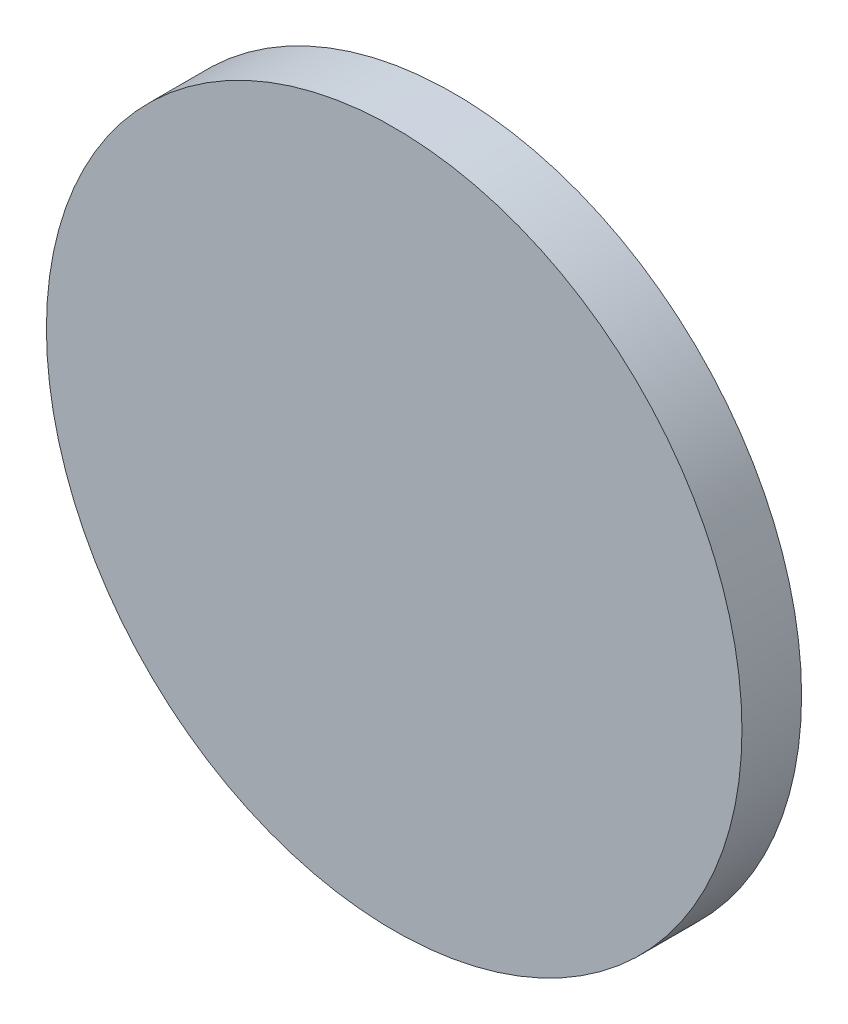
ISO-10303-21;
HEADER;
FILE_DESCRIPTION(('STEP AP214'),'2;1');
FILE_NAME('part.step','',(''),(''),'','','');
FILE_SCHEMA(('AUTOMOTIVE_DESIGN { 1 0 10303 214 1 1 1 1 }'));
ENDSEC;
DATA;
#1=APPLICATION_CONTEXT('core data for automotive mechanical design processes');
#2=APPLICATION_PROTOCOL_DEFINITION('international standard','automotive_design',2000,#1);
#3=PRODUCT_CONTEXT('',#1,'mechanical');
#4=PRODUCT('Part','Part','',(#3));
#5=PRODUCT_RELATED_PRODUCT_CATEGORY('part','',(#4));
#6=PRODUCT_DEFINITION_FORMATION('','',#4);
#7=PRODUCT_DEFINITION_CONTEXT('part definition',#1,'design');
#8=PRODUCT_DEFINITION('design','',#6,#7);
#9=PRODUCT_DEFINITION_SHAPE('','',#8);
#10=(LENGTH_UNIT() NAMED_UNIT(*) SI_UNIT(.MILLI.,.METRE.));
#11=(NAMED_UNIT(*) PLANE_ANGLE_UNIT() SI_UNIT($,.RADIAN.));
#12=(NAMED_UNIT(*) SI_UNIT($,.STERADIAN.) SOLID_ANGLE_UNIT());
#13=UNCERTAINTY_MEASURE_WITH_UNIT(LENGTH_MEASURE(1.E-05),#10,'distance_accuracy_value','');
#14=(GEOMETRIC_REPRESENTATION_CONTEXT(3) GLOBAL_UNCERTAINTY_ASSIGNED_CONTEXT((#13)) GLOBAL_UNIT_ASSIGNED_CONTEXT((#10,
#11,#12)) REPRESENTATION_CONTEXT('',''));
#15=CARTESIAN_POINT('',(0.,0.,0.));
#16=DIRECTION('',(0.,0.,1.));
#17=DIRECTION('',(1.,0.,0.));
#18=AXIS2_PLACEMENT_3D('',#15,#16,#17);
#19=CARTESIAN_POINT('',(0.,0.,0.));
#20=DIRECTION('',(0.,0.,-1.));
#21=DIRECTION('',(-1.,0.,0.));
#22=AXIS2_PLACEMENT_3D('',#19,#20,#21);
#23=PLANE('',#22);
#24=CARTESIAN_POINT('',(0.,0.,0.));
#25=DIRECTION('',(0.,0.,1.));
#26=DIRECTION('',(1.,0.,0.));
#27=AXIS2_PLACEMENT_3D('',#24,#25,#26);
#28=CIRCLE('',#27,66.675);
#29=CARTESIAN_POINT('',(66.675,0.,0.));
#30=VERTEX_POINT('',#29);
#31=EDGE_CURVE('E10',#30,#30,#28,.T.);
#32=ORIENTED_EDGE('',*,*,#31,.T.);
#33=EDGE_LOOP('',(#32));
#34=FACE_BOUND('',#33,.T.);
#35=ADVANCED_FACE('F37',(#34),#23,.F.);
#36=CARTESIAN_POINT('',(0.,0.,0.));
#37=DIRECTION('',(0.,0.,1.));
#38=DIRECTION('',(1.,0.,0.));
#39=AXIS2_PLACEMENT_3D('',#36,#37,#38);
#40=CYLINDRICAL_SURFACE('',#39,66.675);
#41=ORIENTED_EDGE('',*,*,#31,.F.);
#42=EDGE_LOOP('',(#41));
#43=FACE_BOUND('',#42,.T.);
#44=CARTESIAN_POINT('',(0.,0.,-11.43));
#45=DIRECTION('',(0.,0.,1.));
#46=DIRECTION('',(1.,0.,0.));
#47=AXIS2_PLACEMENT_3D('',#44,#45,#46);
#48=CIRCLE('',#47,66.675);
#49=CARTESIAN_POINT('',(66.675,0.,-11.43));
#50=VERTEX_POINT('',#49);
#51=EDGE_CURVE('E43',#50,#50,#48,.T.);
#52=ORIENTED_EDGE('',*,*,#51,.T.);
#53=EDGE_LOOP('',(#52));
#54=FACE_BOUND('',#53,.T.);
#55=ADVANCED_FACE('F69',(#43,#54),#40,.T.);
#56=CARTESIAN_POINT('',(0.,66.675,-11.43));
#57=DIRECTION('',(0.,0.,1.));
#58=DIRECTION('',(1.,0.,0.));
#59=AXIS2_PLACEMENT_3D('',#56,#57,#58);
#60=PLANE('',#59);
#61=ORIENTED_EDGE('',*,*,#51,.F.);
#62=EDGE_LOOP('',(#61));
#63=FACE_BOUND('',#62,.T.);
#64=CARTESIAN_POINT('',(0.,0.,-11.43));
#65=DIRECTION('',(0.,0.,1.));
#66=DIRECTION('',(1.,0.,0.));
#67=AXIS2_PLACEMENT_3D('',#64,#65,#66);
#68=CIRCLE('',#67,63.5);
#69=CARTESIAN_POINT('',(63.5,0.,-11.43));
#70=VERTEX_POINT('',#69);
#71=EDGE_CURVE('E47',#70,#70,#68,.T.);
#72=ORIENTED_EDGE('',*,*,#71,.T.);
#73=EDGE_LOOP('',(#72));
#74=FACE_BOUND('',#73,.T.);
#75=ADVANCED_FACE('F65',(#63,#74),#60,.F.);
#76=CARTESIAN_POINT('',(0.,0.,0.));
#77=DIRECTION('',(0.,0.,1.));
#78=DIRECTION('',(1.,0.,0.));
#79=AXIS2_PLACEMENT_3D('',#76,#77,#78);
#80=CYLINDRICAL_SURFACE('',#79,63.5);
#81=ORIENTED_EDGE('',*,*,#71,.F.);
#82=EDGE_LOOP('',(#81));
#83=FACE_BOUND('',#82,.T.);
#84=CARTESIAN_POINT('',(0.,0.,-5.07999999999999));
#85=DIRECTION('',(0.,0.,1.));
#86=DIRECTION('',(1.,0.,0.));
#87=AXIS2_PLACEMENT_3D('',#84,#85,#86);
#88=CIRCLE('',#87,63.5);
#89=CARTESIAN_POINT('',(63.5,0.,-5.07999999999999));
#90=VERTEX_POINT('',#89);
#91=EDGE_CURVE('E51',#90,#90,#88,.T.);
#92=ORIENTED_EDGE('',*,*,#91,.T.);
#93=EDGE_LOOP('',(#92));
#94=FACE_BOUND('',#93,.T.);
#95=ADVANCED_FACE('F57',(#83,#94),#80,.F.);
#96=CARTESIAN_POINT('',(0.,63.5,-5.08));
#97=DIRECTION('',(0.,0.,1.));
#98=DIRECTION('',(1.,0.,0.));
#99=AXIS2_PLACEMENT_3D('',#96,#97,#98);
#100=PLANE('',#99);
#101=ORIENTED_EDGE('',*,*,#91,.F.);
#102=EDGE_LOOP('',(#101));
#103=FACE_BOUND('',#102,.T.);
#104=ADVANCED_FACE('F59',(#103),#100,.F.);
#105=CLOSED_SHELL('',(#35,#55,#75,#95,#104));
#106=MANIFOLD_SOLID_BREP('B2',#105);
#107=ADVANCED_BREP_SHAPE_REPRESENTATION('',(#18,#106),#14);
#108=SHAPE_DEFINITION_REPRESENTATION(#9,#107);
ENDSEC;
END-ISO-10303-21;
